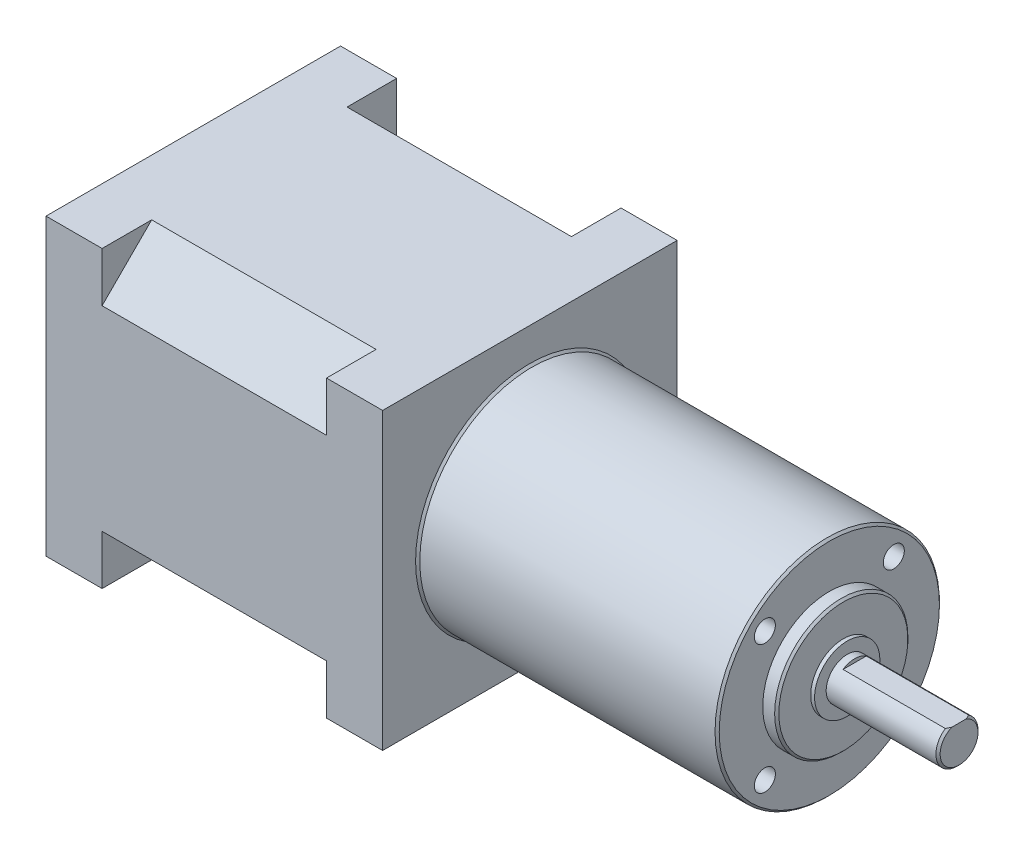
ISO-10303-21;
HEADER;
FILE_DESCRIPTION(('STEP AP214'),'2;1');
FILE_NAME('part.step','',(''),(''),'','','');
FILE_SCHEMA(('AUTOMOTIVE_DESIGN { 1 0 10303 214 1 1 1 1 }'));
ENDSEC;
DATA;
#1=APPLICATION_CONTEXT('core data for automotive mechanical design processes');
#2=APPLICATION_PROTOCOL_DEFINITION('international standard','automotive_design',2000,#1);
#3=PRODUCT_CONTEXT('',#1,'mechanical');
#4=PRODUCT('Part','Part','',(#3));
#5=PRODUCT_RELATED_PRODUCT_CATEGORY('part','',(#4));
#6=PRODUCT_DEFINITION_FORMATION('','',#4);
#7=PRODUCT_DEFINITION_CONTEXT('part definition',#1,'design');
#8=PRODUCT_DEFINITION('design','',#6,#7);
#9=PRODUCT_DEFINITION_SHAPE('','',#8);
#10=(LENGTH_UNIT() NAMED_UNIT(*) SI_UNIT(.MILLI.,.METRE.));
#11=(NAMED_UNIT(*) PLANE_ANGLE_UNIT() SI_UNIT($,.RADIAN.));
#12=(NAMED_UNIT(*) SI_UNIT($,.STERADIAN.) SOLID_ANGLE_UNIT());
#13=UNCERTAINTY_MEASURE_WITH_UNIT(LENGTH_MEASURE(1.E-05),#10,'distance_accuracy_value','');
#14=(GEOMETRIC_REPRESENTATION_CONTEXT(3) GLOBAL_UNCERTAINTY_ASSIGNED_CONTEXT((#13)) GLOBAL_UNIT_ASSIGNED_CONTEXT((#10,
#11,#12)) REPRESENTATION_CONTEXT('',''));
#15=CARTESIAN_POINT('',(0.,0.,0.));
#16=DIRECTION('',(0.,0.,1.));
#17=DIRECTION('',(1.,0.,0.));
#18=AXIS2_PLACEMENT_3D('',#15,#16,#17);
#19=CARTESIAN_POINT('',(48.,0.,-42.));
#20=DIRECTION('',(0.,0.,1.));
#21=DIRECTION('',(1.,0.,0.));
#22=AXIS2_PLACEMENT_3D('',#19,#20,#21);
#23=PLANE('',#22);
#24=DIRECTION('',(0.,-1.,0.));
#25=VECTOR('',#24,1.);
#26=CARTESIAN_POINT('',(8.,0.,-42.));
#27=LINE('',#26,#25);
#28=CARTESIAN_POINT('',(8.,42.,-42.));
#29=VERTEX_POINT('',#28);
#30=CARTESIAN_POINT('',(8.,34.9289321881345,-42.));
#31=VERTEX_POINT('',#30);
#32=EDGE_CURVE('E167',#29,#31,#27,.T.);
#33=ORIENTED_EDGE('',*,*,#32,.T.);
#34=DIRECTION('',(1.,0.,0.));
#35=VECTOR('',#34,1.);
#36=CARTESIAN_POINT('',(8.,34.9289321881345,-42.));
#37=LINE('',#36,#35);
#38=CARTESIAN_POINT('',(40.,34.9289321881345,-42.));
#39=VERTEX_POINT('',#38);
#40=EDGE_CURVE('E792',#31,#39,#37,.T.);
#41=ORIENTED_EDGE('',*,*,#40,.T.);
#42=DIRECTION('',(0.,-1.,0.));
#43=VECTOR('',#42,1.);
#44=CARTESIAN_POINT('',(40.,0.,-42.));
#45=LINE('',#44,#43);
#46=CARTESIAN_POINT('',(40.,42.,-42.));
#47=VERTEX_POINT('',#46);
#48=EDGE_CURVE('E788',#47,#39,#45,.T.);
#49=ORIENTED_EDGE('',*,*,#48,.F.);
#50=DIRECTION('',(-1.,0.,0.));
#51=VECTOR('',#50,1.);
#52=CARTESIAN_POINT('',(48.,42.,-42.));
#53=LINE('',#52,#51);
#54=CARTESIAN_POINT('',(48.,42.,-42.));
#55=VERTEX_POINT('',#54);
#56=EDGE_CURVE('E189',#55,#47,#53,.T.);
#57=ORIENTED_EDGE('',*,*,#56,.F.);
#58=DIRECTION('',(0.,1.,0.));
#59=VECTOR('',#58,1.);
#60=CARTESIAN_POINT('',(48.,0.,-42.));
#61=LINE('',#60,#59);
#62=CARTESIAN_POINT('',(48.,0.,-42.));
#63=VERTEX_POINT('',#62);
#64=EDGE_CURVE('E346',#63,#55,#61,.T.);
#65=ORIENTED_EDGE('',*,*,#64,.F.);
#66=DIRECTION('',(-1.,0.,0.));
#67=VECTOR('',#66,1.);
#68=CARTESIAN_POINT('',(48.,0.,-42.));
#69=LINE('',#68,#67);
#70=CARTESIAN_POINT('',(40.,0.,-42.));
#71=VERTEX_POINT('',#70);
#72=EDGE_CURVE('E199',#63,#71,#69,.T.);
#73=ORIENTED_EDGE('',*,*,#72,.T.);
#74=DIRECTION('',(0.,-1.,0.));
#75=VECTOR('',#74,1.);
#76=CARTESIAN_POINT('',(40.,0.,-42.));
#77=LINE('',#76,#75);
#78=CARTESIAN_POINT('',(40.,7.07106781186548,-42.));
#79=VERTEX_POINT('',#78);
#80=EDGE_CURVE('E804',#79,#71,#77,.T.);
#81=ORIENTED_EDGE('',*,*,#80,.F.);
#82=DIRECTION('',(1.,0.,0.));
#83=VECTOR('',#82,1.);
#84=CARTESIAN_POINT('',(8.,7.07106781186548,-42.));
#85=LINE('',#84,#83);
#86=CARTESIAN_POINT('',(8.,7.07106781186548,-42.));
#87=VERTEX_POINT('',#86);
#88=EDGE_CURVE('E813',#87,#79,#85,.T.);
#89=ORIENTED_EDGE('',*,*,#88,.F.);
#90=DIRECTION('',(0.,-1.,0.));
#91=VECTOR('',#90,1.);
#92=CARTESIAN_POINT('',(8.,0.,-42.));
#93=LINE('',#92,#91);
#94=CARTESIAN_POINT('',(8.,0.,-42.));
#95=VERTEX_POINT('',#94);
#96=EDGE_CURVE('E807',#87,#95,#93,.T.);
#97=ORIENTED_EDGE('',*,*,#96,.T.);
#98=CARTESIAN_POINT('',(0.,0.,-42.));
#99=VERTEX_POINT('',#98);
#100=EDGE_CURVE('E193',#95,#99,#69,.T.);
#101=ORIENTED_EDGE('',*,*,#100,.T.);
#102=DIRECTION('',(0.,1.,0.));
#103=VECTOR('',#102,1.);
#104=CARTESIAN_POINT('',(0.,0.,-42.));
#105=LINE('',#104,#103);
#106=CARTESIAN_POINT('',(0.,42.,-42.));
#107=VERTEX_POINT('',#106);
#108=EDGE_CURVE('E187',#99,#107,#105,.T.);
#109=ORIENTED_EDGE('',*,*,#108,.T.);
#110=EDGE_CURVE('E181',#29,#107,#53,.T.);
#111=ORIENTED_EDGE('',*,*,#110,.F.);
#112=EDGE_LOOP('',(#33,#41,#49,#57,#65,#73,#81,#89,#97,#101,#109,#111));
#113=FACE_BOUND('',#112,.T.);
#114=ADVANCED_FACE('F36',(#113),#23,.F.);
#115=CARTESIAN_POINT('',(48.,42.,0.));
#116=DIRECTION('',(0.,-1.,0.));
#117=DIRECTION('',(0.,0.,-1.));
#118=AXIS2_PLACEMENT_3D('',#115,#116,#117);
#119=PLANE('',#118);
#120=DIRECTION('',(0.,0.,1.));
#121=VECTOR('',#120,1.);
#122=CARTESIAN_POINT('',(8.,42.0000000000001,0.));
#123=LINE('',#122,#121);
#124=CARTESIAN_POINT('',(8.,42.,-34.9289321881346));
#125=VERTEX_POINT('',#124);
#126=EDGE_CURVE('E170',#29,#125,#123,.T.);
#127=ORIENTED_EDGE('',*,*,#126,.F.);
#128=ORIENTED_EDGE('',*,*,#110,.T.);
#129=DIRECTION('',(0.,0.,1.));
#130=VECTOR('',#129,1.);
#131=CARTESIAN_POINT('',(0.,42.,0.));
#132=LINE('',#131,#130);
#133=CARTESIAN_POINT('',(0.,42.,0.));
#134=VERTEX_POINT('',#133);
#135=EDGE_CURVE('E344',#107,#134,#132,.T.);
#136=ORIENTED_EDGE('',*,*,#135,.T.);
#137=DIRECTION('',(-1.,0.,0.));
#138=VECTOR('',#137,1.);
#139=CARTESIAN_POINT('',(48.,42.,0.));
#140=LINE('',#139,#138);
#141=CARTESIAN_POINT('',(8.,42.0000000000001,0.));
#142=VERTEX_POINT('',#141);
#143=EDGE_CURVE('E195',#142,#134,#140,.T.);
#144=ORIENTED_EDGE('',*,*,#143,.F.);
#145=DIRECTION('',(0.,0.,1.));
#146=VECTOR('',#145,1.);
#147=CARTESIAN_POINT('',(8.,42.0000000000001,0.));
#148=LINE('',#147,#146);
#149=CARTESIAN_POINT('',(8.,42.0000000000001,-7.07106781186546));
#150=VERTEX_POINT('',#149);
#151=EDGE_CURVE('E370',#150,#142,#148,.T.);
#152=ORIENTED_EDGE('',*,*,#151,.F.);
#153=DIRECTION('',(1.,0.,0.));
#154=VECTOR('',#153,1.);
#155=CARTESIAN_POINT('',(8.,42.0000000000001,-7.07106781186546));
#156=LINE('',#155,#154);
#157=CARTESIAN_POINT('',(40.,42.0000000000001,-7.07106781186546));
#158=VERTEX_POINT('',#157);
#159=EDGE_CURVE('E369',#150,#158,#156,.T.);
#160=ORIENTED_EDGE('',*,*,#159,.T.);
#161=DIRECTION('',(0.,0.,1.));
#162=VECTOR('',#161,1.);
#163=CARTESIAN_POINT('',(40.,42.0000000000001,0.));
#164=LINE('',#163,#162);
#165=CARTESIAN_POINT('',(40.,42.,0.));
#166=VERTEX_POINT('',#165);
#167=EDGE_CURVE('E381',#158,#166,#164,.T.);
#168=ORIENTED_EDGE('',*,*,#167,.T.);
#169=CARTESIAN_POINT('',(48.,42.,0.));
#170=VERTEX_POINT('',#169);
#171=EDGE_CURVE('E190',#170,#166,#140,.T.);
#172=ORIENTED_EDGE('',*,*,#171,.F.);
#173=DIRECTION('',(0.,0.,1.));
#174=VECTOR('',#173,1.);
#175=CARTESIAN_POINT('',(48.,42.,0.));
#176=LINE('',#175,#174);
#177=EDGE_CURVE('E348',#55,#170,#176,.T.);
#178=ORIENTED_EDGE('',*,*,#177,.F.);
#179=ORIENTED_EDGE('',*,*,#56,.T.);
#180=DIRECTION('',(0.,0.,1.));
#181=VECTOR('',#180,1.);
#182=CARTESIAN_POINT('',(40.,42.0000000000001,0.));
#183=LINE('',#182,#181);
#184=CARTESIAN_POINT('',(40.,42.,-34.9289321881346));
#185=VERTEX_POINT('',#184);
#186=EDGE_CURVE('E789',#47,#185,#183,.T.);
#187=ORIENTED_EDGE('',*,*,#186,.T.);
#188=DIRECTION('',(1.,0.,0.));
#189=VECTOR('',#188,1.);
#190=CARTESIAN_POINT('',(8.,42.,-34.9289321881346));
#191=LINE('',#190,#189);
#192=EDGE_CURVE('E184',#125,#185,#191,.T.);
#193=ORIENTED_EDGE('',*,*,#192,.F.);
#194=EDGE_LOOP('',(#127,#128,#136,#144,#152,#160,#168,#172,#178,#179,#187,#193));
#195=FACE_BOUND('',#194,.T.);
#196=ADVANCED_FACE('F179',(#195),#119,.F.);
#197=CARTESIAN_POINT('',(48.,0.,0.));
#198=DIRECTION('',(0.,1.,0.));
#199=DIRECTION('',(0.,0.,1.));
#200=AXIS2_PLACEMENT_3D('',#197,#198,#199);
#201=PLANE('',#200);
#202=DIRECTION('',(0.,0.,1.));
#203=VECTOR('',#202,1.);
#204=CARTESIAN_POINT('',(8.,0.,0.));
#205=LINE('',#204,#203);
#206=CARTESIAN_POINT('',(8.,0.,-34.9289321881346));
#207=VERTEX_POINT('',#206);
#208=EDGE_CURVE('E803',#95,#207,#205,.T.);
#209=ORIENTED_EDGE('',*,*,#208,.T.);
#210=DIRECTION('',(1.,0.,0.));
#211=VECTOR('',#210,1.);
#212=CARTESIAN_POINT('',(8.,0.,-34.9289321881346));
#213=LINE('',#212,#211);
#214=CARTESIAN_POINT('',(40.,0.,-34.9289321881346));
#215=VERTEX_POINT('',#214);
#216=EDGE_CURVE('E809',#207,#215,#213,.T.);
#217=ORIENTED_EDGE('',*,*,#216,.T.);
#218=DIRECTION('',(0.,0.,1.));
#219=VECTOR('',#218,1.);
#220=CARTESIAN_POINT('',(40.,0.,0.));
#221=LINE('',#220,#219);
#222=EDGE_CURVE('E794',#71,#215,#221,.T.);
#223=ORIENTED_EDGE('',*,*,#222,.F.);
#224=ORIENTED_EDGE('',*,*,#72,.F.);
#225=DIRECTION('',(0.,0.,-1.));
#226=VECTOR('',#225,1.);
#227=CARTESIAN_POINT('',(48.,0.,0.));
#228=LINE('',#227,#226);
#229=CARTESIAN_POINT('',(48.,0.,0.));
#230=VERTEX_POINT('',#229);
#231=EDGE_CURVE('E343',#230,#63,#228,.T.);
#232=ORIENTED_EDGE('',*,*,#231,.F.);
#233=DIRECTION('',(-1.,0.,0.));
#234=VECTOR('',#233,1.);
#235=CARTESIAN_POINT('',(48.,0.,0.));
#236=LINE('',#235,#234);
#237=CARTESIAN_POINT('',(40.,0.,0.));
#238=VERTEX_POINT('',#237);
#239=EDGE_CURVE('E203',#230,#238,#236,.T.);
#240=ORIENTED_EDGE('',*,*,#239,.T.);
#241=DIRECTION('',(0.,0.,1.));
#242=VECTOR('',#241,1.);
#243=CARTESIAN_POINT('',(40.,0.,0.));
#244=LINE('',#243,#242);
#245=CARTESIAN_POINT('',(40.,0.,-7.07106781186549));
#246=VERTEX_POINT('',#245);
#247=EDGE_CURVE('E822',#246,#238,#244,.T.);
#248=ORIENTED_EDGE('',*,*,#247,.F.);
#249=DIRECTION('',(1.,0.,0.));
#250=VECTOR('',#249,1.);
#251=CARTESIAN_POINT('',(8.,0.,-7.07106781186549));
#252=LINE('',#251,#250);
#253=CARTESIAN_POINT('',(8.,0.,-7.07106781186549));
#254=VERTEX_POINT('',#253);
#255=EDGE_CURVE('E382',#254,#246,#252,.T.);
#256=ORIENTED_EDGE('',*,*,#255,.F.);
#257=DIRECTION('',(0.,0.,1.));
#258=VECTOR('',#257,1.);
#259=CARTESIAN_POINT('',(8.,0.,0.));
#260=LINE('',#259,#258);
#261=CARTESIAN_POINT('',(8.,0.,0.));
#262=VERTEX_POINT('',#261);
#263=EDGE_CURVE('E824',#254,#262,#260,.T.);
#264=ORIENTED_EDGE('',*,*,#263,.T.);
#265=CARTESIAN_POINT('',(0.,0.,0.));
#266=VERTEX_POINT('',#265);
#267=EDGE_CURVE('E202',#262,#266,#236,.T.);
#268=ORIENTED_EDGE('',*,*,#267,.T.);
#269=DIRECTION('',(0.,0.,-1.));
#270=VECTOR('',#269,1.);
#271=CARTESIAN_POINT('',(0.,0.,0.));
#272=LINE('',#271,#270);
#273=EDGE_CURVE('E352',#266,#99,#272,.T.);
#274=ORIENTED_EDGE('',*,*,#273,.T.);
#275=ORIENTED_EDGE('',*,*,#100,.F.);
#276=EDGE_LOOP('',(#209,#217,#223,#224,#232,#240,#248,#256,#264,#268,#274,#275));
#277=FACE_BOUND('',#276,.T.);
#278=ADVANCED_FACE('F299',(#277),#201,.F.);
#279=CARTESIAN_POINT('',(48.,0.,0.));
#280=DIRECTION('',(0.,0.,-1.));
#281=DIRECTION('',(-1.,0.,0.));
#282=AXIS2_PLACEMENT_3D('',#279,#280,#281);
#283=PLANE('',#282);
#284=DIRECTION('',(0.,-1.,0.));
#285=VECTOR('',#284,1.);
#286=CARTESIAN_POINT('',(8.,0.,0.));
#287=LINE('',#286,#285);
#288=CARTESIAN_POINT('',(8.,7.07106781186545,0.));
#289=VERTEX_POINT('',#288);
#290=EDGE_CURVE('E821',#289,#262,#287,.T.);
#291=ORIENTED_EDGE('',*,*,#290,.F.);
#292=DIRECTION('',(1.,0.,0.));
#293=VECTOR('',#292,1.);
#294=CARTESIAN_POINT('',(8.,7.07106781186545,0.));
#295=LINE('',#294,#293);
#296=CARTESIAN_POINT('',(40.,7.07106781186545,0.));
#297=VERTEX_POINT('',#296);
#298=EDGE_CURVE('E827',#289,#297,#295,.T.);
#299=ORIENTED_EDGE('',*,*,#298,.T.);
#300=DIRECTION('',(0.,-1.,0.));
#301=VECTOR('',#300,1.);
#302=CARTESIAN_POINT('',(40.,0.,0.));
#303=LINE('',#302,#301);
#304=EDGE_CURVE('E829',#297,#238,#303,.T.);
#305=ORIENTED_EDGE('',*,*,#304,.T.);
#306=ORIENTED_EDGE('',*,*,#239,.F.);
#307=DIRECTION('',(0.,-1.,0.));
#308=VECTOR('',#307,1.);
#309=CARTESIAN_POINT('',(48.,0.,0.));
#310=LINE('',#309,#308);
#311=EDGE_CURVE('E340',#170,#230,#310,.T.);
#312=ORIENTED_EDGE('',*,*,#311,.F.);
#313=ORIENTED_EDGE('',*,*,#171,.T.);
#314=DIRECTION('',(0.,-1.,0.));
#315=VECTOR('',#314,1.);
#316=CARTESIAN_POINT('',(40.,0.,0.));
#317=LINE('',#316,#315);
#318=CARTESIAN_POINT('',(40.,34.9289321881345,0.));
#319=VERTEX_POINT('',#318);
#320=EDGE_CURVE('E385',#166,#319,#317,.T.);
#321=ORIENTED_EDGE('',*,*,#320,.T.);
#322=DIRECTION('',(1.,0.,0.));
#323=VECTOR('',#322,1.);
#324=CARTESIAN_POINT('',(8.,34.9289321881345,0.));
#325=LINE('',#324,#323);
#326=CARTESIAN_POINT('',(8.,34.9289321881345,0.));
#327=VERTEX_POINT('',#326);
#328=EDGE_CURVE('E366',#327,#319,#325,.T.);
#329=ORIENTED_EDGE('',*,*,#328,.F.);
#330=DIRECTION('',(0.,-1.,0.));
#331=VECTOR('',#330,1.);
#332=CARTESIAN_POINT('',(8.,0.,0.));
#333=LINE('',#332,#331);
#334=EDGE_CURVE('E364',#142,#327,#333,.T.);
#335=ORIENTED_EDGE('',*,*,#334,.F.);
#336=ORIENTED_EDGE('',*,*,#143,.T.);
#337=DIRECTION('',(0.,-1.,0.));
#338=VECTOR('',#337,1.);
#339=CARTESIAN_POINT('',(0.,0.,0.));
#340=LINE('',#339,#338);
#341=EDGE_CURVE('E333',#134,#266,#340,.T.);
#342=ORIENTED_EDGE('',*,*,#341,.T.);
#343=ORIENTED_EDGE('',*,*,#267,.F.);
#344=EDGE_LOOP('',(#291,#299,#305,#306,#312,#313,#321,#329,#335,#336,#342,#343));
#345=FACE_BOUND('',#344,.T.);
#346=ADVANCED_FACE('F265',(#345),#283,.F.);
#347=CARTESIAN_POINT('',(109.2,21.,-21.));
#348=DIRECTION('',(1.,0.,0.));
#349=DIRECTION('',(0.,0.,-1.));
#350=AXIS2_PLACEMENT_3D('',#347,#348,#349);
#351=CYLINDRICAL_SURFACE('',#350,3.);
#352=CARTESIAN_POINT('',(93.2521637666534,21.,-21.));
#353=DIRECTION('',(1.,0.,0.));
#354=DIRECTION('',(0.,0.,-1.));
#355=AXIS2_PLACEMENT_3D('',#352,#353,#354);
#356=CIRCLE('',#355,3.00000000000001);
#357=CARTESIAN_POINT('',(93.2521637666534,21.,-24.));
#358=VERTEX_POINT('',#357);
#359=EDGE_CURVE('E336',#358,#358,#356,.T.);
#360=ORIENTED_EDGE('',*,*,#359,.T.);
#361=EDGE_LOOP('',(#360));
#362=FACE_BOUND('',#361,.T.);
#363=DIRECTION('',(1.,0.,0.));
#364=VECTOR('',#363,1.);
#365=CARTESIAN_POINT('',(109.2,23.5,-22.6583123951777));
#366=LINE('',#365,#364);
#367=CARTESIAN_POINT('',(108.9,23.5,-22.6583123951777));
#368=VERTEX_POINT('',#367);
#369=CARTESIAN_POINT('',(94.314883906727,23.5,-22.6583123951777));
#370=VERTEX_POINT('',#369);
#371=EDGE_CURVE('E415',#368,#370,#366,.F.);
#372=ORIENTED_EDGE('',*,*,#371,.F.);
#373=CARTESIAN_POINT('',(108.9,21.,-21.));
#374=DIRECTION('',(-1.,0.,0.));
#375=DIRECTION('',(0.,0.,1.));
#376=AXIS2_PLACEMENT_3D('',#373,#374,#375);
#377=CIRCLE('',#376,3.);
#378=CARTESIAN_POINT('',(108.9,23.5,-19.3416876048223));
#379=VERTEX_POINT('',#378);
#380=EDGE_CURVE('E11',#368,#379,#377,.T.);
#381=ORIENTED_EDGE('',*,*,#380,.T.);
#382=DIRECTION('',(1.,0.,0.));
#383=VECTOR('',#382,1.);
#384=CARTESIAN_POINT('',(109.2,23.5,-19.3416876048223));
#385=LINE('',#384,#383);
#386=CARTESIAN_POINT('',(94.314883906727,23.5,-19.3416876048223));
#387=VERTEX_POINT('',#386);
#388=EDGE_CURVE('E417',#387,#379,#385,.T.);
#389=ORIENTED_EDGE('',*,*,#388,.F.);
#390=CARTESIAN_POINT('',(94.314883906727,21.,-21.));
#391=DIRECTION('',(1.,0.,0.));
#392=DIRECTION('',(0.,0.,-1.));
#393=AXIS2_PLACEMENT_3D('',#390,#391,#392);
#394=CIRCLE('',#393,3.);
#395=EDGE_CURVE('E209',#370,#387,#394,.T.);
#396=ORIENTED_EDGE('',*,*,#395,.F.);
#397=EDGE_LOOP('',(#372,#381,#389,#396));
#398=FACE_BOUND('',#397,.T.);
#399=ADVANCED_FACE('F261',(#362,#398),#351,.T.);
#400=CARTESIAN_POINT('',(109.2,24.,-21.));
#401=DIRECTION('',(-1.,0.,0.));
#402=DIRECTION('',(0.,0.,1.));
#403=AXIS2_PLACEMENT_3D('',#400,#401,#402);
#404=PLANE('',#403);
#405=DIRECTION('',(0.,0.,-1.));
#406=VECTOR('',#405,1.);
#407=CARTESIAN_POINT('',(109.2,23.5,-21.));
#408=LINE('',#407,#406);
#409=CARTESIAN_POINT('',(109.2,23.5,-19.9801960972814));
#410=VERTEX_POINT('',#409);
#411=CARTESIAN_POINT('',(109.2,23.5,-22.0198039027186));
#412=VERTEX_POINT('',#411);
#413=EDGE_CURVE('E206',#410,#412,#408,.T.);
#414=ORIENTED_EDGE('',*,*,#413,.F.);
#415=CARTESIAN_POINT('',(109.2,21.,-21.));
#416=DIRECTION('',(-1.,0.,0.));
#417=DIRECTION('',(0.,0.,1.));
#418=AXIS2_PLACEMENT_3D('',#415,#416,#417);
#419=CIRCLE('',#418,2.70000000000001);
#420=EDGE_CURVE('E229',#410,#412,#419,.F.);
#421=ORIENTED_EDGE('',*,*,#420,.T.);
#422=EDGE_LOOP('',(#414,#421));
#423=FACE_BOUND('',#422,.T.);
#424=ADVANCED_FACE('F257',(#423),#404,.F.);
#425=CARTESIAN_POINT('',(90.7,21.,-21.));
#426=DIRECTION('',(1.,0.,0.));
#427=DIRECTION('',(0.,0.,-1.));
#428=AXIS2_PLACEMENT_3D('',#425,#426,#427);
#429=PLANE('',#428);
#430=CARTESIAN_POINT('',(90.7,30.1923881554251,-11.8076118445749));
#431=DIRECTION('',(1.,0.,0.));
#432=DIRECTION('',(0.,0.,-1.));
#433=AXIS2_PLACEMENT_3D('',#430,#431,#432);
#434=CIRCLE('',#433,1.5);
#435=CARTESIAN_POINT('',(90.7,30.1923881554251,-13.3076118445749));
#436=VERTEX_POINT('',#435);
#437=EDGE_CURVE('E387',#436,#436,#434,.T.);
#438=ORIENTED_EDGE('',*,*,#437,.F.);
#439=EDGE_LOOP('',(#438));
#440=FACE_BOUND('',#439,.T.);
#441=CARTESIAN_POINT('',(90.7,11.8076118445749,-11.8076118445749));
#442=DIRECTION('',(1.,0.,0.));
#443=DIRECTION('',(0.,0.,-1.));
#444=AXIS2_PLACEMENT_3D('',#441,#442,#443);
#445=CIRCLE('',#444,1.5);
#446=CARTESIAN_POINT('',(90.7,11.8076118445749,-13.3076118445749));
#447=VERTEX_POINT('',#446);
#448=EDGE_CURVE('E392',#447,#447,#445,.T.);
#449=ORIENTED_EDGE('',*,*,#448,.F.);
#450=EDGE_LOOP('',(#449));
#451=FACE_BOUND('',#450,.T.);
#452=CARTESIAN_POINT('',(90.7,11.8076118445749,-30.1923881554251));
#453=DIRECTION('',(1.,0.,0.));
#454=DIRECTION('',(0.,0.,-1.));
#455=AXIS2_PLACEMENT_3D('',#452,#453,#454);
#456=CIRCLE('',#455,1.5);
#457=CARTESIAN_POINT('',(90.7,11.8076118445749,-31.6923881554251));
#458=VERTEX_POINT('',#457);
#459=EDGE_CURVE('E398',#458,#458,#456,.T.);
#460=ORIENTED_EDGE('',*,*,#459,.F.);
#461=EDGE_LOOP('',(#460));
#462=FACE_BOUND('',#461,.T.);
#463=CARTESIAN_POINT('',(90.7,30.1923881554251,-30.1923881554251));
#464=DIRECTION('',(1.,0.,0.));
#465=DIRECTION('',(0.,0.,-1.));
#466=AXIS2_PLACEMENT_3D('',#463,#464,#465);
#467=CIRCLE('',#466,1.5);
#468=CARTESIAN_POINT('',(90.7,30.1923881554251,-31.6923881554251));
#469=VERTEX_POINT('',#468);
#470=EDGE_CURVE('E404',#469,#469,#467,.T.);
#471=ORIENTED_EDGE('',*,*,#470,.F.);
#472=EDGE_LOOP('',(#471));
#473=FACE_BOUND('',#472,.T.);
#474=CARTESIAN_POINT('',(90.7,21.,-21.));
#475=DIRECTION('',(1.,0.,0.));
#476=DIRECTION('',(0.,0.,-1.));
#477=AXIS2_PLACEMENT_3D('',#474,#475,#476);
#478=CIRCLE('',#477,15.7);
#479=CARTESIAN_POINT('',(90.7,21.,-36.7));
#480=VERTEX_POINT('',#479);
#481=EDGE_CURVE('E220',#480,#480,#478,.T.);
#482=ORIENTED_EDGE('',*,*,#481,.T.);
#483=EDGE_LOOP('',(#482));
#484=FACE_BOUND('',#483,.T.);
#485=CARTESIAN_POINT('',(90.7,21.,-21.));
#486=DIRECTION('',(1.,0.,0.));
#487=DIRECTION('',(0.,0.,-1.));
#488=AXIS2_PLACEMENT_3D('',#485,#486,#487);
#489=CIRCLE('',#488,9.5);
#490=CARTESIAN_POINT('',(90.7,21.,-30.5));
#491=VERTEX_POINT('',#490);
#492=EDGE_CURVE('E329',#491,#491,#489,.T.);
#493=ORIENTED_EDGE('',*,*,#492,.F.);
#494=EDGE_LOOP('',(#493));
#495=FACE_BOUND('',#494,.T.);
#496=ADVANCED_FACE('F260',(#440,#451,#462,#473,#484,#495),#429,.T.);
#497=CARTESIAN_POINT('',(48.,0.,0.));
#498=DIRECTION('',(-1.,0.,0.));
#499=DIRECTION('',(0.,0.,1.));
#500=AXIS2_PLACEMENT_3D('',#497,#498,#499);
#501=PLANE('',#500);
#502=CARTESIAN_POINT('',(48.,21.,-21.));
#503=DIRECTION('',(-1.,0.,0.));
#504=DIRECTION('',(0.,0.,1.));
#505=AXIS2_PLACEMENT_3D('',#502,#503,#504);
#506=CIRCLE('',#505,16.3000000000001);
#507=CARTESIAN_POINT('',(48.,21.,-4.6999999999999));
#508=VERTEX_POINT('',#507);
#509=EDGE_CURVE('E217',#508,#508,#506,.T.);
#510=ORIENTED_EDGE('',*,*,#509,.T.);
#511=EDGE_LOOP('',(#510));
#512=FACE_BOUND('',#511,.T.);
#513=ORIENTED_EDGE('',*,*,#311,.T.);
#514=ORIENTED_EDGE('',*,*,#231,.T.);
#515=ORIENTED_EDGE('',*,*,#64,.T.);
#516=ORIENTED_EDGE('',*,*,#177,.T.);
#517=EDGE_LOOP('',(#513,#514,#515,#516));
#518=FACE_BOUND('',#517,.T.);
#519=ADVANCED_FACE('F285',(#512,#518),#501,.F.);
#520=CARTESIAN_POINT('',(0.,0.,0.));
#521=DIRECTION('',(-1.,0.,0.));
#522=DIRECTION('',(0.,0.,1.));
#523=AXIS2_PLACEMENT_3D('',#520,#521,#522);
#524=PLANE('',#523);
#525=ORIENTED_EDGE('',*,*,#341,.F.);
#526=ORIENTED_EDGE('',*,*,#135,.F.);
#527=ORIENTED_EDGE('',*,*,#108,.F.);
#528=ORIENTED_EDGE('',*,*,#273,.F.);
#529=EDGE_LOOP('',(#525,#526,#527,#528));
#530=FACE_BOUND('',#529,.T.);
#531=ADVANCED_FACE('F289',(#530),#524,.T.);
#532=CARTESIAN_POINT('',(90.7,21.,-21.));
#533=DIRECTION('',(-1.,0.,0.));
#534=DIRECTION('',(0.,0.,1.));
#535=AXIS2_PLACEMENT_3D('',#532,#533,#534);
#536=CYLINDRICAL_SURFACE('',#535,16.);
#537=CARTESIAN_POINT('',(48.3000000000001,21.,-21.));
#538=DIRECTION('',(-1.,0.,0.));
#539=DIRECTION('',(0.,0.,1.));
#540=AXIS2_PLACEMENT_3D('',#537,#538,#539);
#541=CIRCLE('',#540,16.);
#542=CARTESIAN_POINT('',(48.3000000000001,21.,-4.99999999999999));
#543=VERTEX_POINT('',#542);
#544=EDGE_CURVE('E214',#543,#543,#541,.F.);
#545=CARTESIAN_POINT('',(90.4,21.,-21.));
#546=DIRECTION('',(1.,0.,0.));
#547=DIRECTION('',(0.,0.,-1.));
#548=AXIS2_PLACEMENT_3D('',#545,#546,#547);
#549=CIRCLE('',#548,16.);
#550=CARTESIAN_POINT('',(90.4,21.,-4.99999999999999));
#551=VERTEX_POINT('',#550);
#552=EDGE_CURVE('E211',#551,#551,#549,.F.);
#553=CARTESIAN_POINT('',(48.3000000000001,21.,-4.99999999999999));
#554=CARTESIAN_POINT('',(48.7385416666668,21.,-4.99999999999999));
#555=CARTESIAN_POINT('',(49.1770833333334,21.,-4.99999999999999));
#556=CARTESIAN_POINT('',(50.0541666666668,21.,-4.99999999999999));
#557=CARTESIAN_POINT('',(50.4927083333334,21.,-4.99999999999999));
#558=CARTESIAN_POINT('',(51.3697916666668,21.,-4.99999999999999));
#559=CARTESIAN_POINT('',(51.8083333333334,21.,-4.99999999999999));
#560=CARTESIAN_POINT('',(52.6854166666668,21.,-4.99999999999999));
#561=CARTESIAN_POINT('',(53.1239583333334,21.,-4.99999999999999));
#562=CARTESIAN_POINT('',(54.0010416666668,21.,-4.99999999999999));
#563=CARTESIAN_POINT('',(54.4395833333334,21.,-4.99999999999999));
#564=CARTESIAN_POINT('',(55.3166666666668,21.,-4.99999999999999));
#565=CARTESIAN_POINT('',(55.7552083333334,21.,-4.99999999999999));
#566=CARTESIAN_POINT('',(56.6322916666668,21.,-4.99999999999999));
#567=CARTESIAN_POINT('',(57.0708333333334,21.,-4.99999999999999));
#568=CARTESIAN_POINT('',(57.9479166666668,21.,-4.99999999999999));
#569=CARTESIAN_POINT('',(58.3864583333334,21.,-4.99999999999999));
#570=CARTESIAN_POINT('',(59.2635416666668,21.,-4.99999999999999));
#571=CARTESIAN_POINT('',(59.7020833333334,21.,-4.99999999999999));
#572=CARTESIAN_POINT('',(60.5791666666668,21.,-4.99999999999999));
#573=CARTESIAN_POINT('',(61.0177083333334,21.,-4.99999999999999));
#574=CARTESIAN_POINT('',(61.8947916666667,21.,-4.99999999999999));
#575=CARTESIAN_POINT('',(62.3333333333334,21.,-4.99999999999999));
#576=CARTESIAN_POINT('',(63.2104166666667,21.,-4.99999999999999));
#577=CARTESIAN_POINT('',(63.6489583333334,21.,-4.99999999999999));
#578=CARTESIAN_POINT('',(64.5260416666667,21.,-4.99999999999999));
#579=CARTESIAN_POINT('',(64.9645833333334,21.,-4.99999999999999));
#580=CARTESIAN_POINT('',(65.8416666666667,21.,-4.99999999999999));
#581=CARTESIAN_POINT('',(66.2802083333334,21.,-4.99999999999999));
#582=CARTESIAN_POINT('',(67.1572916666667,21.,-4.99999999999999));
#583=CARTESIAN_POINT('',(67.5958333333334,21.,-4.99999999999999));
#584=CARTESIAN_POINT('',(68.4729166666667,21.,-4.99999999999999));
#585=CARTESIAN_POINT('',(68.9114583333334,21.,-4.99999999999999));
#586=CARTESIAN_POINT('',(69.7885416666667,21.,-4.99999999999999));
#587=CARTESIAN_POINT('',(70.2270833333334,21.,-4.99999999999999));
#588=CARTESIAN_POINT('',(71.1041666666667,21.,-4.99999999999999));
#589=CARTESIAN_POINT('',(71.5427083333334,21.,-4.99999999999999));
#590=CARTESIAN_POINT('',(72.4197916666667,21.,-4.99999999999999));
#591=CARTESIAN_POINT('',(72.8583333333334,21.,-4.99999999999999));
#592=CARTESIAN_POINT('',(73.7354166666667,21.,-4.99999999999999));
#593=CARTESIAN_POINT('',(74.1739583333334,21.,-4.99999999999999));
#594=CARTESIAN_POINT('',(75.0510416666667,21.,-4.99999999999999));
#595=CARTESIAN_POINT('',(75.4895833333334,21.,-4.99999999999999));
#596=CARTESIAN_POINT('',(76.3666666666667,21.,-4.99999999999999));
#597=CARTESIAN_POINT('',(76.8052083333334,21.,-4.99999999999999));
#598=CARTESIAN_POINT('',(77.6822916666667,21.,-4.99999999999999));
#599=CARTESIAN_POINT('',(78.1208333333334,21.,-4.99999999999999));
#600=CARTESIAN_POINT('',(78.9979166666667,21.,-4.99999999999999));
#601=CARTESIAN_POINT('',(79.4364583333334,21.,-4.99999999999999));
#602=CARTESIAN_POINT('',(80.3135416666667,21.,-4.99999999999999));
#603=CARTESIAN_POINT('',(80.7520833333334,21.,-4.99999999999999));
#604=CARTESIAN_POINT('',(81.6291666666667,21.,-4.99999999999999));
#605=CARTESIAN_POINT('',(82.0677083333334,21.,-4.99999999999999));
#606=CARTESIAN_POINT('',(82.9447916666667,21.,-4.99999999999999));
#607=CARTESIAN_POINT('',(83.3833333333334,21.,-4.99999999999999));
#608=CARTESIAN_POINT('',(84.2604166666667,21.,-4.99999999999999));
#609=CARTESIAN_POINT('',(84.6989583333334,21.,-4.99999999999999));
#610=CARTESIAN_POINT('',(85.5760416666667,21.,-4.99999999999999));
#611=CARTESIAN_POINT('',(86.0145833333334,21.,-4.99999999999999));
#612=CARTESIAN_POINT('',(86.8916666666667,21.,-4.99999999999999));
#613=CARTESIAN_POINT('',(87.3302083333334,21.,-4.99999999999999));
#614=CARTESIAN_POINT('',(88.2072916666667,21.,-4.99999999999999));
#615=CARTESIAN_POINT('',(88.6458333333334,21.,-4.99999999999999));
#616=CARTESIAN_POINT('',(89.5229166666667,21.,-4.99999999999999));
#617=CARTESIAN_POINT('',(89.9614583333334,21.,-4.99999999999999));
#618=CARTESIAN_POINT('',(90.4,21.,-4.99999999999999));
#619=B_SPLINE_CURVE_WITH_KNOTS('',3,(#553,#554,#555,#556,#557,#558,#559,#560,#561,#562,#563,
#564,#565,#566,#567,#568,#569,#570,#571,#572,#573,#574,#575,#576,#577,#578,#579,#580,#581,#582,
#583,#584,#585,#586,#587,#588,#589,#590,#591,#592,#593,#594,#595,#596,#597,#598,#599,#600,#601,
#602,#603,#604,#605,#606,#607,#608,#609,#610,#611,#612,#613,#614,#615,#616,#617,#618),
.UNSPECIFIED.,.F.,.F.,(4,2,2,2,2,2,2,2,2,2,2,2,2,2,2,2,2,2,2,2,2,2,2,2,2,2,2,2,2,2,2,2,4),(0.,
1.315625,2.63124999999999,3.946875,5.2625,6.57812499999999,7.89374999999999,9.20937499999999,
10.525,11.840625,13.15625,14.471875,15.7875,17.103125,18.41875,19.734375,21.05,22.365625,
23.68125,24.996875,26.3125,27.628125,28.94375,30.259375,31.575,32.890625,34.20625,35.521875,
36.8374999999999,38.1531249999999,39.46875,40.7843749999999,42.1),.UNSPECIFIED.);
#620=EDGE_CURVE('BSEAM281',#543,#551,#619,.T.);
#621=ORIENTED_EDGE('',*,*,#544,.T.);
#622=ORIENTED_EDGE('',*,*,#552,.T.);
#623=ORIENTED_EDGE('',*,*,#620,.T.);
#624=ORIENTED_EDGE('',*,*,#620,.F.);
#625=EDGE_LOOP('',(#621,#623,#622,#624));
#626=FACE_BOUND('',#625,.T.);
#627=ADVANCED_FACE('F281',(#626),#536,.T.);
#628=CARTESIAN_POINT('',(109.2,21.,-21.));
#629=DIRECTION('',(1.,0.,0.));
#630=DIRECTION('',(0.,0.,-1.));
#631=AXIS2_PLACEMENT_3D('',#628,#629,#630);
#632=CYLINDRICAL_SURFACE('',#631,9.5);
#633=CARTESIAN_POINT('',(92.4,21.,-21.));
#634=DIRECTION('',(-1.,0.,0.));
#635=DIRECTION('',(0.,0.,1.));
#636=AXIS2_PLACEMENT_3D('',#633,#634,#635);
#637=CIRCLE('',#636,9.5);
#638=CARTESIAN_POINT('',(92.4,21.,-11.5));
#639=VERTEX_POINT('',#638);
#640=EDGE_CURVE('E226',#639,#639,#637,.T.);
#641=ORIENTED_EDGE('',*,*,#640,.T.);
#642=EDGE_LOOP('',(#641));
#643=FACE_BOUND('',#642,.T.);
#644=ORIENTED_EDGE('',*,*,#492,.T.);
#645=EDGE_LOOP('',(#644));
#646=FACE_BOUND('',#645,.T.);
#647=ADVANCED_FACE('F277',(#643,#646),#632,.T.);
#648=CARTESIAN_POINT('',(92.7,30.5,-21.));
#649=DIRECTION('',(-1.,0.,0.));
#650=DIRECTION('',(0.,0.,1.));
#651=AXIS2_PLACEMENT_3D('',#648,#649,#650);
#652=PLANE('',#651);
#653=CARTESIAN_POINT('',(92.7,21.,-21.));
#654=DIRECTION('',(-1.,0.,0.));
#655=DIRECTION('',(0.,0.,1.));
#656=AXIS2_PLACEMENT_3D('',#653,#654,#655);
#657=CIRCLE('',#656,9.20000000000001);
#658=CARTESIAN_POINT('',(92.7,21.,-11.8));
#659=VERTEX_POINT('',#658);
#660=EDGE_CURVE('E223',#659,#659,#657,.F.);
#661=ORIENTED_EDGE('',*,*,#660,.T.);
#662=EDGE_LOOP('',(#661));
#663=FACE_BOUND('',#662,.T.);
#664=CARTESIAN_POINT('',(92.7,21.,-21.));
#665=DIRECTION('',(1.,0.,0.));
#666=DIRECTION('',(0.,0.,-1.));
#667=AXIS2_PLACEMENT_3D('',#664,#665,#666);
#668=CIRCLE('',#667,4.65608714033721);
#669=CARTESIAN_POINT('',(92.7,21.,-25.6560871403372));
#670=VERTEX_POINT('',#669);
#671=EDGE_CURVE('E327',#670,#670,#668,.T.);
#672=ORIENTED_EDGE('',*,*,#671,.F.);
#673=EDGE_LOOP('',(#672));
#674=FACE_BOUND('',#673,.T.);
#675=ADVANCED_FACE('F273',(#663,#674),#652,.F.);
#676=CARTESIAN_POINT('',(109.2,21.,-21.));
#677=DIRECTION('',(1.,0.,0.));
#678=DIRECTION('',(0.,0.,-1.));
#679=AXIS2_PLACEMENT_3D('',#676,#677,#678);
#680=CYLINDRICAL_SURFACE('',#679,4.65608714033721);
#681=CARTESIAN_POINT('',(93.2521637666534,21.,-21.));
#682=DIRECTION('',(1.,0.,0.));
#683=DIRECTION('',(0.,0.,-1.));
#684=AXIS2_PLACEMENT_3D('',#681,#682,#683);
#685=CIRCLE('',#684,4.65608714033721);
#686=CARTESIAN_POINT('',(93.2521637666534,21.,-25.6560871403372));
#687=VERTEX_POINT('',#686);
#688=EDGE_CURVE('E330',#687,#687,#685,.T.);
#689=ORIENTED_EDGE('',*,*,#688,.F.);
#690=EDGE_LOOP('',(#689));
#691=FACE_BOUND('',#690,.T.);
#692=ORIENTED_EDGE('',*,*,#671,.T.);
#693=EDGE_LOOP('',(#692));
#694=FACE_BOUND('',#693,.T.);
#695=ADVANCED_FACE('F269',(#691,#694),#680,.T.);
#696=CARTESIAN_POINT('',(93.2521637666534,25.6560871403372,-21.));
#697=DIRECTION('',(-1.,0.,0.));
#698=DIRECTION('',(0.,0.,1.));
#699=AXIS2_PLACEMENT_3D('',#696,#697,#698);
#700=PLANE('',#699);
#701=ORIENTED_EDGE('',*,*,#359,.F.);
#702=EDGE_LOOP('',(#701));
#703=FACE_BOUND('',#702,.T.);
#704=ORIENTED_EDGE('',*,*,#688,.T.);
#705=EDGE_LOOP('',(#704));
#706=FACE_BOUND('',#705,.T.);
#707=ADVANCED_FACE('F255',(#703,#706),#700,.F.);
#708=CARTESIAN_POINT('',(94.314883906727,25.5,-14.5731700912393));
#709=DIRECTION('',(1.,0.,0.));
#710=DIRECTION('',(0.,0.,-1.));
#711=AXIS2_PLACEMENT_3D('',#708,#709,#710);
#712=PLANE('',#711);
#713=ORIENTED_EDGE('',*,*,#395,.T.);
#714=DIRECTION('',(0.,0.,1.));
#715=VECTOR('',#714,1.);
#716=CARTESIAN_POINT('',(94.314883906727,23.5,-14.5731700912393));
#717=LINE('',#716,#715);
#718=EDGE_CURVE('E410',#370,#387,#717,.T.);
#719=ORIENTED_EDGE('',*,*,#718,.F.);
#720=EDGE_LOOP('',(#713,#719));
#721=FACE_BOUND('',#720,.T.);
#722=ADVANCED_FACE('F248',(#721),#712,.T.);
#723=CARTESIAN_POINT('',(0.,23.5,0.));
#724=DIRECTION('',(0.,1.,0.));
#725=DIRECTION('',(0.,0.,1.));
#726=AXIS2_PLACEMENT_3D('',#723,#724,#725);
#727=PLANE('',#726);
#728=ORIENTED_EDGE('',*,*,#413,.T.);
#729=CARTESIAN_POINT('',(109.2,23.5,-22.0198039027186));
#730=CARTESIAN_POINT('',(109.179187033596,23.5,-22.0748959760017));
#731=CARTESIAN_POINT('',(109.157121290018,23.5,-22.1295006085571));
#732=CARTESIAN_POINT('',(109.110822136008,23.5,-22.237702366692));
#733=CARTESIAN_POINT('',(109.086591542267,23.5,-22.2913006947276));
#734=CARTESIAN_POINT('',(109.036251095157,23.5,-22.3975867553571));
#735=CARTESIAN_POINT('',(109.010141653169,23.5,-22.4502746841727));
#736=CARTESIAN_POINT('',(108.956254120382,23.5,-22.5548772674443));
#737=CARTESIAN_POINT('',(108.928473930998,23.5,-22.6067908426711));
#738=CARTESIAN_POINT('',(108.9,23.5,-22.6583123951777));
#739=B_SPLINE_CURVE_WITH_KNOTS('',3,(#729,#730,#731,#732,#733,#734,#735,#736,#737,#738),
.UNSPECIFIED.,.F.,.F.,(4,2,2,2,4),(0.,0.176642918106645,0.353059262668654,0.529437096932236,
0.706041299526568),.UNSPECIFIED.);
#740=EDGE_CURVE('E45',#412,#368,#739,.T.);
#741=ORIENTED_EDGE('',*,*,#740,.T.);
#742=ORIENTED_EDGE('',*,*,#371,.T.);
#743=ORIENTED_EDGE('',*,*,#718,.T.);
#744=ORIENTED_EDGE('',*,*,#388,.T.);
#745=CARTESIAN_POINT('',(108.9,23.5,-19.3416876048223));
#746=CARTESIAN_POINT('',(108.928473930998,23.5,-19.3932091573289));
#747=CARTESIAN_POINT('',(108.956254120382,23.5,-19.4451227325557));
#748=CARTESIAN_POINT('',(109.010141653169,23.5,-19.5497253158273));
#749=CARTESIAN_POINT('',(109.036251095157,23.5,-19.6024132446429));
#750=CARTESIAN_POINT('',(109.086591542267,23.5,-19.7086993052724));
#751=CARTESIAN_POINT('',(109.110822136008,23.5,-19.762297633308));
#752=CARTESIAN_POINT('',(109.157121290018,23.5,-19.8704993914429));
#753=CARTESIAN_POINT('',(109.179187033596,23.5,-19.9251040239983));
#754=CARTESIAN_POINT('',(109.2,23.5,-19.9801960972814));
#755=B_SPLINE_CURVE_WITH_KNOTS('',3,(#745,#746,#747,#748,#749,#750,#751,#752,#753,#754),
.UNSPECIFIED.,.F.,.F.,(4,2,2,2,4),(0.,0.176604202594331,0.352982036857914,0.529398381419923,
0.706041299526564),.UNSPECIFIED.);
#756=EDGE_CURVE('E232',#379,#410,#755,.T.);
#757=ORIENTED_EDGE('',*,*,#756,.T.);
#758=EDGE_LOOP('',(#728,#741,#742,#743,#744,#757));
#759=FACE_BOUND('',#758,.T.);
#760=ADVANCED_FACE('F242',(#759),#727,.T.);
#761=CARTESIAN_POINT('',(48.3000000000001,21.,-21.));
#762=DIRECTION('',(-1.,0.,0.));
#763=DIRECTION('',(0.,0.,1.));
#764=AXIS2_PLACEMENT_3D('',#761,#762,#763);
#765=CONICAL_SURFACE('',#764,16.,0.785398163397454);
#766=ORIENTED_EDGE('',*,*,#509,.F.);
#767=EDGE_LOOP('',(#766));
#768=FACE_BOUND('',#767,.T.);
#769=ORIENTED_EDGE('',*,*,#544,.F.);
#770=EDGE_LOOP('',(#769));
#771=FACE_BOUND('',#770,.T.);
#772=ADVANCED_FACE('F247',(#768,#771),#765,.T.);
#773=CARTESIAN_POINT('',(90.7,21.,-21.));
#774=DIRECTION('',(-1.,0.,0.));
#775=DIRECTION('',(0.,0.,1.));
#776=AXIS2_PLACEMENT_3D('',#773,#774,#775);
#777=CONICAL_SURFACE('',#776,15.7,0.785398163397454);
#778=ORIENTED_EDGE('',*,*,#552,.F.);
#779=EDGE_LOOP('',(#778));
#780=FACE_BOUND('',#779,.T.);
#781=ORIENTED_EDGE('',*,*,#481,.F.);
#782=EDGE_LOOP('',(#781));
#783=FACE_BOUND('',#782,.T.);
#784=ADVANCED_FACE('F310',(#780,#783),#777,.T.);
#785=CARTESIAN_POINT('',(92.7,21.,-21.));
#786=DIRECTION('',(-1.,0.,0.));
#787=DIRECTION('',(0.,0.,1.));
#788=AXIS2_PLACEMENT_3D('',#785,#786,#787);
#789=CONICAL_SURFACE('',#788,9.20000000000001,0.78539816339744);
#790=ORIENTED_EDGE('',*,*,#640,.F.);
#791=EDGE_LOOP('',(#790));
#792=FACE_BOUND('',#791,.T.);
#793=ORIENTED_EDGE('',*,*,#660,.F.);
#794=EDGE_LOOP('',(#793));
#795=FACE_BOUND('',#794,.T.);
#796=ADVANCED_FACE('F313',(#792,#795),#789,.T.);
#797=CARTESIAN_POINT('',(109.2,21.,-21.));
#798=DIRECTION('',(-1.,0.,0.));
#799=DIRECTION('',(0.,0.,1.));
#800=AXIS2_PLACEMENT_3D('',#797,#798,#799);
#801=CONICAL_SURFACE('',#800,2.70000000000001,0.785398163397448);
#802=ORIENTED_EDGE('',*,*,#756,.F.);
#803=ORIENTED_EDGE('',*,*,#380,.F.);
#804=ORIENTED_EDGE('',*,*,#740,.F.);
#805=ORIENTED_EDGE('',*,*,#420,.F.);
#806=EDGE_LOOP('',(#802,#803,#804,#805));
#807=FACE_BOUND('',#806,.T.);
#808=ADVANCED_FACE('F38',(#807),#801,.T.);
#809=CARTESIAN_POINT('',(80.7,30.1923881554251,-30.1923881554251));
#810=DIRECTION('',(1.,0.,0.));
#811=DIRECTION('',(0.,0.,-1.));
#812=AXIS2_PLACEMENT_3D('',#809,#810,#811);
#813=CYLINDRICAL_SURFACE('',#812,1.5);
#814=CARTESIAN_POINT('',(80.7,30.1923881554251,-30.1923881554251));
#815=DIRECTION('',(1.,0.,0.));
#816=DIRECTION('',(0.,0.,-1.));
#817=AXIS2_PLACEMENT_3D('',#814,#815,#816);
#818=CIRCLE('',#817,1.5);
#819=CARTESIAN_POINT('',(80.7,30.1923881554251,-31.6923881554251));
#820=VERTEX_POINT('',#819);
#821=EDGE_CURVE('E407',#820,#820,#818,.T.);
#822=ORIENTED_EDGE('',*,*,#821,.F.);
#823=EDGE_LOOP('',(#822));
#824=FACE_BOUND('',#823,.T.);
#825=ORIENTED_EDGE('',*,*,#470,.T.);
#826=EDGE_LOOP('',(#825));
#827=FACE_BOUND('',#826,.T.);
#828=ADVANCED_FACE('F250',(#824,#827),#813,.F.);
#829=CARTESIAN_POINT('',(80.7,0.,0.));
#830=DIRECTION('',(1.,0.,0.));
#831=DIRECTION('',(0.,0.,-1.));
#832=AXIS2_PLACEMENT_3D('',#829,#830,#831);
#833=PLANE('',#832);
#834=ORIENTED_EDGE('',*,*,#821,.T.);
#835=EDGE_LOOP('',(#834));
#836=FACE_BOUND('',#835,.T.);
#837=ADVANCED_FACE('F442',(#836),#833,.T.);
#838=CARTESIAN_POINT('',(80.7,11.8076118445749,-30.1923881554251));
#839=DIRECTION('',(1.,0.,0.));
#840=DIRECTION('',(0.,0.,-1.));
#841=AXIS2_PLACEMENT_3D('',#838,#839,#840);
#842=CYLINDRICAL_SURFACE('',#841,1.5);
#843=CARTESIAN_POINT('',(80.7,11.8076118445749,-30.1923881554251));
#844=DIRECTION('',(1.,0.,0.));
#845=DIRECTION('',(0.,0.,-1.));
#846=AXIS2_PLACEMENT_3D('',#843,#844,#845);
#847=CIRCLE('',#846,1.5);
#848=CARTESIAN_POINT('',(80.7,11.8076118445749,-31.6923881554251));
#849=VERTEX_POINT('',#848);
#850=EDGE_CURVE('E401',#849,#849,#847,.T.);
#851=ORIENTED_EDGE('',*,*,#850,.F.);
#852=EDGE_LOOP('',(#851));
#853=FACE_BOUND('',#852,.T.);
#854=ORIENTED_EDGE('',*,*,#459,.T.);
#855=EDGE_LOOP('',(#854));
#856=FACE_BOUND('',#855,.T.);
#857=ADVANCED_FACE('F447',(#853,#856),#842,.F.);
#858=CARTESIAN_POINT('',(80.7,0.,0.));
#859=DIRECTION('',(1.,0.,0.));
#860=DIRECTION('',(0.,0.,-1.));
#861=AXIS2_PLACEMENT_3D('',#858,#859,#860);
#862=PLANE('',#861);
#863=ORIENTED_EDGE('',*,*,#850,.T.);
#864=EDGE_LOOP('',(#863));
#865=FACE_BOUND('',#864,.T.);
#866=ADVANCED_FACE('F453',(#865),#862,.T.);
#867=CARTESIAN_POINT('',(80.7,11.8076118445749,-11.8076118445749));
#868=DIRECTION('',(1.,0.,0.));
#869=DIRECTION('',(0.,0.,-1.));
#870=AXIS2_PLACEMENT_3D('',#867,#868,#869);
#871=CYLINDRICAL_SURFACE('',#870,1.5);
#872=CARTESIAN_POINT('',(80.7,11.8076118445749,-11.8076118445749));
#873=DIRECTION('',(1.,0.,0.));
#874=DIRECTION('',(0.,0.,-1.));
#875=AXIS2_PLACEMENT_3D('',#872,#873,#874);
#876=CIRCLE('',#875,1.5);
#877=CARTESIAN_POINT('',(80.7,11.8076118445749,-13.3076118445749));
#878=VERTEX_POINT('',#877);
#879=EDGE_CURVE('E395',#878,#878,#876,.T.);
#880=ORIENTED_EDGE('',*,*,#879,.F.);
#881=EDGE_LOOP('',(#880));
#882=FACE_BOUND('',#881,.T.);
#883=ORIENTED_EDGE('',*,*,#448,.T.);
#884=EDGE_LOOP('',(#883));
#885=FACE_BOUND('',#884,.T.);
#886=ADVANCED_FACE('F459',(#882,#885),#871,.F.);
#887=CARTESIAN_POINT('',(80.7,0.,0.));
#888=DIRECTION('',(1.,0.,0.));
#889=DIRECTION('',(0.,0.,-1.));
#890=AXIS2_PLACEMENT_3D('',#887,#888,#889);
#891=PLANE('',#890);
#892=ORIENTED_EDGE('',*,*,#879,.T.);
#893=EDGE_LOOP('',(#892));
#894=FACE_BOUND('',#893,.T.);
#895=ADVANCED_FACE('F463',(#894),#891,.T.);
#896=CARTESIAN_POINT('',(80.7,30.1923881554251,-11.8076118445749));
#897=DIRECTION('',(1.,0.,0.));
#898=DIRECTION('',(0.,0.,-1.));
#899=AXIS2_PLACEMENT_3D('',#896,#897,#898);
#900=CYLINDRICAL_SURFACE('',#899,1.5);
#901=CARTESIAN_POINT('',(80.7,30.1923881554251,-11.8076118445749));
#902=DIRECTION('',(1.,0.,0.));
#903=DIRECTION('',(0.,0.,-1.));
#904=AXIS2_PLACEMENT_3D('',#901,#902,#903);
#905=CIRCLE('',#904,1.5);
#906=CARTESIAN_POINT('',(80.7,30.1923881554251,-13.3076118445749));
#907=VERTEX_POINT('',#906);
#908=EDGE_CURVE('E389',#907,#907,#905,.T.);
#909=ORIENTED_EDGE('',*,*,#908,.F.);
#910=EDGE_LOOP('',(#909));
#911=FACE_BOUND('',#910,.T.);
#912=ORIENTED_EDGE('',*,*,#437,.T.);
#913=EDGE_LOOP('',(#912));
#914=FACE_BOUND('',#913,.T.);
#915=ADVANCED_FACE('F467',(#911,#914),#900,.F.);
#916=CARTESIAN_POINT('',(80.7,0.,0.));
#917=DIRECTION('',(1.,0.,0.));
#918=DIRECTION('',(0.,0.,-1.));
#919=AXIS2_PLACEMENT_3D('',#916,#917,#918);
#920=PLANE('',#919);
#921=ORIENTED_EDGE('',*,*,#908,.T.);
#922=EDGE_LOOP('',(#921));
#923=FACE_BOUND('',#922,.T.);
#924=ADVANCED_FACE('F471',(#923),#920,.T.);
#925=CARTESIAN_POINT('',(8.,17.4644660940672,17.4644660940673));
#926=DIRECTION('',(0.,0.707106781186546,0.707106781186549));
#927=DIRECTION('',(0.,-0.707106781186549,0.707106781186546));
#928=AXIS2_PLACEMENT_3D('',#925,#926,#927);
#929=PLANE('',#928);
#930=DIRECTION('',(0.,-0.707106781186549,0.707106781186546));
#931=VECTOR('',#930,1.);
#932=CARTESIAN_POINT('',(40.,17.4644660940672,17.4644660940673));
#933=LINE('',#932,#931);
#934=EDGE_CURVE('E378',#158,#319,#933,.T.);
#935=ORIENTED_EDGE('',*,*,#934,.F.);
#936=ORIENTED_EDGE('',*,*,#159,.F.);
#937=DIRECTION('',(0.,-0.707106781186549,0.707106781186546));
#938=VECTOR('',#937,1.);
#939=CARTESIAN_POINT('',(8.,17.4644660940672,17.4644660940673));
#940=LINE('',#939,#938);
#941=EDGE_CURVE('E374',#150,#327,#940,.T.);
#942=ORIENTED_EDGE('',*,*,#941,.T.);
#943=ORIENTED_EDGE('',*,*,#328,.T.);
#944=EDGE_LOOP('',(#935,#936,#942,#943));
#945=FACE_BOUND('',#944,.T.);
#946=ADVANCED_FACE('F475',(#945),#929,.T.);
#947=CARTESIAN_POINT('',(8.,0.,0.));
#948=DIRECTION('',(1.,0.,0.));
#949=DIRECTION('',(0.,0.,-1.));
#950=AXIS2_PLACEMENT_3D('',#947,#948,#949);
#951=PLANE('',#950);
#952=ORIENTED_EDGE('',*,*,#941,.F.);
#953=ORIENTED_EDGE('',*,*,#151,.T.);
#954=ORIENTED_EDGE('',*,*,#334,.T.);
#955=EDGE_LOOP('',(#952,#953,#954));
#956=FACE_BOUND('',#955,.T.);
#957=ADVANCED_FACE('F479',(#956),#951,.T.);
#958=CARTESIAN_POINT('',(40.,0.,0.));
#959=DIRECTION('',(1.,0.,0.));
#960=DIRECTION('',(0.,0.,-1.));
#961=AXIS2_PLACEMENT_3D('',#958,#959,#960);
#962=PLANE('',#961);
#963=ORIENTED_EDGE('',*,*,#934,.T.);
#964=ORIENTED_EDGE('',*,*,#320,.F.);
#965=ORIENTED_EDGE('',*,*,#167,.F.);
#966=EDGE_LOOP('',(#963,#964,#965));
#967=FACE_BOUND('',#966,.T.);
#968=ADVANCED_FACE('F481',(#967),#962,.F.);
#969=CARTESIAN_POINT('',(8.,3.53553390593275,-3.53553390593273));
#970=DIRECTION('',(0.,-0.707106781186549,0.707106781186546));
#971=DIRECTION('',(0.,-0.707106781186546,-0.707106781186549));
#972=AXIS2_PLACEMENT_3D('',#969,#970,#971);
#973=PLANE('',#972);
#974=DIRECTION('',(0.,-0.707106781186546,-0.707106781186549));
#975=VECTOR('',#974,1.);
#976=CARTESIAN_POINT('',(40.,3.53553390593275,-3.53553390593273));
#977=LINE('',#976,#975);
#978=EDGE_CURVE('E815',#297,#246,#977,.T.);
#979=ORIENTED_EDGE('',*,*,#978,.F.);
#980=ORIENTED_EDGE('',*,*,#298,.F.);
#981=DIRECTION('',(0.,-0.707106781186546,-0.707106781186549));
#982=VECTOR('',#981,1.);
#983=CARTESIAN_POINT('',(8.,3.53553390593275,-3.53553390593273));
#984=LINE('',#983,#982);
#985=EDGE_CURVE('E818',#289,#254,#984,.T.);
#986=ORIENTED_EDGE('',*,*,#985,.T.);
#987=ORIENTED_EDGE('',*,*,#255,.T.);
#988=EDGE_LOOP('',(#979,#980,#986,#987));
#989=FACE_BOUND('',#988,.T.);
#990=ADVANCED_FACE('F484',(#989),#973,.T.);
#991=CARTESIAN_POINT('',(8.,0.,0.));
#992=DIRECTION('',(1.,0.,0.));
#993=DIRECTION('',(0.,0.,-1.));
#994=AXIS2_PLACEMENT_3D('',#991,#992,#993);
#995=PLANE('',#994);
#996=ORIENTED_EDGE('',*,*,#985,.F.);
#997=ORIENTED_EDGE('',*,*,#290,.T.);
#998=ORIENTED_EDGE('',*,*,#263,.F.);
#999=EDGE_LOOP('',(#996,#997,#998));
#1000=FACE_BOUND('',#999,.T.);
#1001=ADVANCED_FACE('F490',(#1000),#995,.T.);
#1002=CARTESIAN_POINT('',(40.,0.,0.));
#1003=DIRECTION('',(1.,0.,0.));
#1004=DIRECTION('',(0.,0.,-1.));
#1005=AXIS2_PLACEMENT_3D('',#1002,#1003,#1004);
#1006=PLANE('',#1005);
#1007=ORIENTED_EDGE('',*,*,#978,.T.);
#1008=ORIENTED_EDGE('',*,*,#247,.T.);
#1009=ORIENTED_EDGE('',*,*,#304,.F.);
#1010=EDGE_LOOP('',(#1007,#1008,#1009));
#1011=FACE_BOUND('',#1010,.T.);
#1012=ADVANCED_FACE('F492',(#1011),#1006,.F.);
#1013=CARTESIAN_POINT('',(8.,-17.4644660940673,-17.4644660940674));
#1014=DIRECTION('',(0.,-0.707106781186546,-0.707106781186549));
#1015=DIRECTION('',(0.,0.707106781186549,-0.707106781186546));
#1016=AXIS2_PLACEMENT_3D('',#1013,#1014,#1015);
#1017=PLANE('',#1016);
#1018=DIRECTION('',(0.,0.707106781186549,-0.707106781186546));
#1019=VECTOR('',#1018,1.);
#1020=CARTESIAN_POINT('',(40.,-17.4644660940673,-17.4644660940674));
#1021=LINE('',#1020,#1019);
#1022=EDGE_CURVE('E60',#215,#79,#1021,.T.);
#1023=ORIENTED_EDGE('',*,*,#1022,.F.);
#1024=ORIENTED_EDGE('',*,*,#216,.F.);
#1025=DIRECTION('',(0.,0.707106781186549,-0.707106781186546));
#1026=VECTOR('',#1025,1.);
#1027=CARTESIAN_POINT('',(8.,-17.4644660940673,-17.4644660940674));
#1028=LINE('',#1027,#1026);
#1029=EDGE_CURVE('E800',#207,#87,#1028,.T.);
#1030=ORIENTED_EDGE('',*,*,#1029,.T.);
#1031=ORIENTED_EDGE('',*,*,#88,.T.);
#1032=EDGE_LOOP('',(#1023,#1024,#1030,#1031));
#1033=FACE_BOUND('',#1032,.T.);
#1034=ADVANCED_FACE('F495',(#1033),#1017,.T.);
#1035=CARTESIAN_POINT('',(8.,0.,0.));
#1036=DIRECTION('',(1.,0.,0.));
#1037=DIRECTION('',(0.,0.,-1.));
#1038=AXIS2_PLACEMENT_3D('',#1035,#1036,#1037);
#1039=PLANE('',#1038);
#1040=ORIENTED_EDGE('',*,*,#1029,.F.);
#1041=ORIENTED_EDGE('',*,*,#208,.F.);
#1042=ORIENTED_EDGE('',*,*,#96,.F.);
#1043=EDGE_LOOP('',(#1040,#1041,#1042));
#1044=FACE_BOUND('',#1043,.T.);
#1045=ADVANCED_FACE('F502',(#1044),#1039,.T.);
#1046=CARTESIAN_POINT('',(40.,0.,0.));
#1047=DIRECTION('',(1.,0.,0.));
#1048=DIRECTION('',(0.,0.,-1.));
#1049=AXIS2_PLACEMENT_3D('',#1046,#1047,#1048);
#1050=PLANE('',#1049);
#1051=ORIENTED_EDGE('',*,*,#1022,.T.);
#1052=ORIENTED_EDGE('',*,*,#80,.T.);
#1053=ORIENTED_EDGE('',*,*,#222,.T.);
#1054=EDGE_LOOP('',(#1051,#1052,#1053));
#1055=FACE_BOUND('',#1054,.T.);
#1056=ADVANCED_FACE('F504',(#1055),#1050,.F.);
#1057=CARTESIAN_POINT('',(8.,38.4644660940671,-38.4644660940675));
#1058=DIRECTION('',(0.,0.707106781186544,-0.707106781186551));
#1059=DIRECTION('',(0.,0.707106781186551,0.707106781186544));
#1060=AXIS2_PLACEMENT_3D('',#1057,#1058,#1059);
#1061=PLANE('',#1060);
#1062=DIRECTION('',(0.,0.707106781186551,0.707106781186544));
#1063=VECTOR('',#1062,1.);
#1064=CARTESIAN_POINT('',(40.,38.4644660940671,-38.4644660940675));
#1065=LINE('',#1064,#1063);
#1066=EDGE_CURVE('E52',#39,#185,#1065,.T.);
#1067=ORIENTED_EDGE('',*,*,#1066,.F.);
#1068=ORIENTED_EDGE('',*,*,#40,.F.);
#1069=DIRECTION('',(0.,0.707106781186551,0.707106781186544));
#1070=VECTOR('',#1069,1.);
#1071=CARTESIAN_POINT('',(8.,38.4644660940671,-38.4644660940675));
#1072=LINE('',#1071,#1070);
#1073=EDGE_CURVE('E172',#31,#125,#1072,.T.);
#1074=ORIENTED_EDGE('',*,*,#1073,.T.);
#1075=ORIENTED_EDGE('',*,*,#192,.T.);
#1076=EDGE_LOOP('',(#1067,#1068,#1074,#1075));
#1077=FACE_BOUND('',#1076,.T.);
#1078=ADVANCED_FACE('F507',(#1077),#1061,.T.);
#1079=CARTESIAN_POINT('',(8.,0.,0.));
#1080=DIRECTION('',(1.,0.,0.));
#1081=DIRECTION('',(0.,0.,-1.));
#1082=AXIS2_PLACEMENT_3D('',#1079,#1080,#1081);
#1083=PLANE('',#1082);
#1084=ORIENTED_EDGE('',*,*,#32,.F.);
#1085=ORIENTED_EDGE('',*,*,#126,.T.);
#1086=ORIENTED_EDGE('',*,*,#1073,.F.);
#1087=EDGE_LOOP('',(#1084,#1085,#1086));
#1088=FACE_BOUND('',#1087,.T.);
#1089=ADVANCED_FACE('F169',(#1088),#1083,.T.);
#1090=CARTESIAN_POINT('',(40.,0.,0.));
#1091=DIRECTION('',(1.,0.,0.));
#1092=DIRECTION('',(0.,0.,-1.));
#1093=AXIS2_PLACEMENT_3D('',#1090,#1091,#1092);
#1094=PLANE('',#1093);
#1095=ORIENTED_EDGE('',*,*,#48,.T.);
#1096=ORIENTED_EDGE('',*,*,#1066,.T.);
#1097=ORIENTED_EDGE('',*,*,#186,.F.);
#1098=EDGE_LOOP('',(#1095,#1096,#1097));
#1099=FACE_BOUND('',#1098,.T.);
#1100=ADVANCED_FACE('F514',(#1099),#1094,.F.);
#1101=CLOSED_SHELL('',(#114,#196,#278,#346,#399,#424,#496,#519,#531,#627,#647,#675,#695,#707,
#722,#760,#772,#784,#796,#808,#828,#837,#857,#866,#886,#895,#915,#924,#946,#957,#968,#990,#1001,
#1012,#1034,#1045,#1056,#1078,#1089,#1100));
#1102=MANIFOLD_SOLID_BREP('B2',#1101);
#1103=ADVANCED_BREP_SHAPE_REPRESENTATION('',(#18,#1102),#14);
#1104=SHAPE_DEFINITION_REPRESENTATION(#9,#1103);
ENDSEC;
END-ISO-10303-21;
